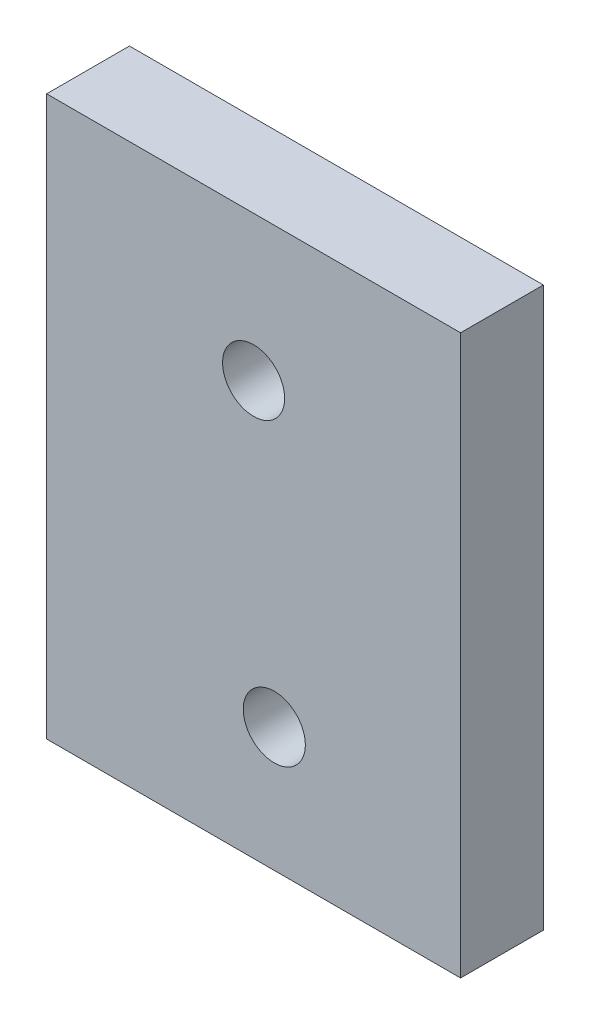
ISO-10303-21;
HEADER;
FILE_DESCRIPTION(('STEP AP214'),'2;1');
FILE_NAME('part.step','',(''),(''),'','','');
FILE_SCHEMA(('AUTOMOTIVE_DESIGN { 1 0 10303 214 1 1 1 1 }'));
ENDSEC;
DATA;
#1=APPLICATION_CONTEXT('core data for automotive mechanical design processes');
#2=APPLICATION_PROTOCOL_DEFINITION('international standard','automotive_design',2000,#1);
#3=PRODUCT_CONTEXT('',#1,'mechanical');
#4=PRODUCT('Part','Part','',(#3));
#5=PRODUCT_RELATED_PRODUCT_CATEGORY('part','',(#4));
#6=PRODUCT_DEFINITION_FORMATION('','',#4);
#7=PRODUCT_DEFINITION_CONTEXT('part definition',#1,'design');
#8=PRODUCT_DEFINITION('design','',#6,#7);
#9=PRODUCT_DEFINITION_SHAPE('','',#8);
#10=(LENGTH_UNIT() NAMED_UNIT(*) SI_UNIT(.MILLI.,.METRE.));
#11=(NAMED_UNIT(*) PLANE_ANGLE_UNIT() SI_UNIT($,.RADIAN.));
#12=(NAMED_UNIT(*) SI_UNIT($,.STERADIAN.) SOLID_ANGLE_UNIT());
#13=UNCERTAINTY_MEASURE_WITH_UNIT(LENGTH_MEASURE(1.E-05),#10,'distance_accuracy_value','');
#14=(GEOMETRIC_REPRESENTATION_CONTEXT(3) GLOBAL_UNCERTAINTY_ASSIGNED_CONTEXT((#13)) GLOBAL_UNIT_ASSIGNED_CONTEXT((#10,
#11,#12)) REPRESENTATION_CONTEXT('',''));
#15=CARTESIAN_POINT('',(0.,0.,0.));
#16=DIRECTION('',(0.,0.,1.));
#17=DIRECTION('',(1.,0.,0.));
#18=AXIS2_PLACEMENT_3D('',#15,#16,#17);
#19=CARTESIAN_POINT('',(0.,0.,4.));
#20=DIRECTION('',(0.,0.,-1.));
#21=DIRECTION('',(-1.,0.,0.));
#22=AXIS2_PLACEMENT_3D('',#19,#20,#21);
#23=PLANE('',#22);
#24=DIRECTION('',(0.,1.,0.));
#25=VECTOR('',#24,1.);
#26=CARTESIAN_POINT('',(10.,-13.5,4.));
#27=LINE('',#26,#25);
#28=CARTESIAN_POINT('',(10.,-13.5,4.));
#29=VERTEX_POINT('',#28);
#30=CARTESIAN_POINT('',(10.,13.5,4.));
#31=VERTEX_POINT('',#30);
#32=EDGE_CURVE('E92',#29,#31,#27,.T.);
#33=ORIENTED_EDGE('',*,*,#32,.T.);
#34=DIRECTION('',(-1.,0.,0.));
#35=VECTOR('',#34,1.);
#36=CARTESIAN_POINT('',(-10.,13.5,4.));
#37=LINE('',#36,#35);
#38=CARTESIAN_POINT('',(-10.,13.5,4.));
#39=VERTEX_POINT('',#38);
#40=EDGE_CURVE('E87',#31,#39,#37,.T.);
#41=ORIENTED_EDGE('',*,*,#40,.T.);
#42=DIRECTION('',(0.,-1.,0.));
#43=VECTOR('',#42,1.);
#44=CARTESIAN_POINT('',(-10.,-13.5,4.));
#45=LINE('',#44,#43);
#46=CARTESIAN_POINT('',(-10.,-13.5,4.));
#47=VERTEX_POINT('',#46);
#48=EDGE_CURVE('E90',#39,#47,#45,.T.);
#49=ORIENTED_EDGE('',*,*,#48,.T.);
#50=DIRECTION('',(1.,0.,0.));
#51=VECTOR('',#50,1.);
#52=CARTESIAN_POINT('',(-10.,-13.5,4.));
#53=LINE('',#52,#51);
#54=EDGE_CURVE('E57',#47,#29,#53,.T.);
#55=ORIENTED_EDGE('',*,*,#54,.T.);
#56=EDGE_LOOP('',(#33,#41,#49,#55));
#57=FACE_BOUND('',#56,.T.);
#58=CARTESIAN_POINT('',(1.00000000000001,-7.49999999999999,4.));
#59=DIRECTION('',(0.,0.,1.));
#60=DIRECTION('',(1.,0.,0.));
#61=AXIS2_PLACEMENT_3D('',#58,#59,#60);
#62=CIRCLE('',#61,1.5);
#63=CARTESIAN_POINT('',(2.50000000000001,-7.49999999999999,4.));
#64=VERTEX_POINT('',#63);
#65=EDGE_CURVE('E112',#64,#64,#62,.T.);
#66=ORIENTED_EDGE('',*,*,#65,.F.);
#67=EDGE_LOOP('',(#66));
#68=FACE_BOUND('',#67,.T.);
#69=CARTESIAN_POINT('',(0.,6.50000000000001,4.));
#70=DIRECTION('',(0.,0.,1.));
#71=DIRECTION('',(1.,0.,0.));
#72=AXIS2_PLACEMENT_3D('',#69,#70,#71);
#73=CIRCLE('',#72,1.5);
#74=CARTESIAN_POINT('',(1.5,6.50000000000001,4.));
#75=VERTEX_POINT('',#74);
#76=EDGE_CURVE('E134',#75,#75,#73,.T.);
#77=ORIENTED_EDGE('',*,*,#76,.F.);
#78=EDGE_LOOP('',(#77));
#79=FACE_BOUND('',#78,.T.);
#80=ADVANCED_FACE('F39',(#57,#68,#79),#23,.F.);
#81=CARTESIAN_POINT('',(0.,0.,0.));
#82=DIRECTION('',(0.,0.,-1.));
#83=DIRECTION('',(-1.,0.,0.));
#84=AXIS2_PLACEMENT_3D('',#81,#82,#83);
#85=PLANE('',#84);
#86=CARTESIAN_POINT('',(1.00000000000001,-7.49999999999999,0.));
#87=DIRECTION('',(0.,0.,1.));
#88=DIRECTION('',(1.,0.,0.));
#89=AXIS2_PLACEMENT_3D('',#86,#87,#88);
#90=CIRCLE('',#89,1.5);
#91=CARTESIAN_POINT('',(2.50000000000001,-7.49999999999999,0.));
#92=VERTEX_POINT('',#91);
#93=EDGE_CURVE('E130',#92,#92,#90,.T.);
#94=ORIENTED_EDGE('',*,*,#93,.T.);
#95=EDGE_LOOP('',(#94));
#96=FACE_BOUND('',#95,.T.);
#97=DIRECTION('',(0.,1.,0.));
#98=VECTOR('',#97,1.);
#99=CARTESIAN_POINT('',(10.,-13.5,0.));
#100=LINE('',#99,#98);
#101=CARTESIAN_POINT('',(10.,-13.5,0.));
#102=VERTEX_POINT('',#101);
#103=CARTESIAN_POINT('',(10.,13.5,0.));
#104=VERTEX_POINT('',#103);
#105=EDGE_CURVE('E108',#102,#104,#100,.T.);
#106=ORIENTED_EDGE('',*,*,#105,.F.);
#107=DIRECTION('',(1.,0.,0.));
#108=VECTOR('',#107,1.);
#109=CARTESIAN_POINT('',(-10.,-13.5,0.));
#110=LINE('',#109,#108);
#111=CARTESIAN_POINT('',(-10.,-13.5,0.));
#112=VERTEX_POINT('',#111);
#113=EDGE_CURVE('E80',#112,#102,#110,.T.);
#114=ORIENTED_EDGE('',*,*,#113,.F.);
#115=DIRECTION('',(0.,-1.,0.));
#116=VECTOR('',#115,1.);
#117=CARTESIAN_POINT('',(-10.,-13.5,0.));
#118=LINE('',#117,#116);
#119=CARTESIAN_POINT('',(-10.,13.5,0.));
#120=VERTEX_POINT('',#119);
#121=EDGE_CURVE('E74',#120,#112,#118,.T.);
#122=ORIENTED_EDGE('',*,*,#121,.F.);
#123=DIRECTION('',(-1.,0.,0.));
#124=VECTOR('',#123,1.);
#125=CARTESIAN_POINT('',(-10.,13.5,0.));
#126=LINE('',#125,#124);
#127=EDGE_CURVE('E97',#104,#120,#126,.T.);
#128=ORIENTED_EDGE('',*,*,#127,.F.);
#129=EDGE_LOOP('',(#106,#114,#122,#128));
#130=FACE_BOUND('',#129,.T.);
#131=CARTESIAN_POINT('',(0.,6.50000000000001,0.));
#132=DIRECTION('',(0.,0.,1.));
#133=DIRECTION('',(1.,0.,0.));
#134=AXIS2_PLACEMENT_3D('',#131,#132,#133);
#135=CIRCLE('',#134,1.5);
#136=CARTESIAN_POINT('',(1.5,6.50000000000001,0.));
#137=VERTEX_POINT('',#136);
#138=EDGE_CURVE('E138',#137,#137,#135,.T.);
#139=ORIENTED_EDGE('',*,*,#138,.T.);
#140=EDGE_LOOP('',(#139));
#141=FACE_BOUND('',#140,.T.);
#142=ADVANCED_FACE('F125',(#96,#130,#141),#85,.T.);
#143=CARTESIAN_POINT('',(10.,-13.5,4.));
#144=DIRECTION('',(-1.,0.,0.));
#145=DIRECTION('',(0.,-1.,0.));
#146=AXIS2_PLACEMENT_3D('',#143,#144,#145);
#147=PLANE('',#146);
#148=ORIENTED_EDGE('',*,*,#105,.T.);
#149=DIRECTION('',(0.,0.,-1.));
#150=VECTOR('',#149,1.);
#151=CARTESIAN_POINT('',(10.,13.5,4.));
#152=LINE('',#151,#150);
#153=EDGE_CURVE('E11',#31,#104,#152,.T.);
#154=ORIENTED_EDGE('',*,*,#153,.F.);
#155=ORIENTED_EDGE('',*,*,#32,.F.);
#156=DIRECTION('',(0.,0.,-1.));
#157=VECTOR('',#156,1.);
#158=CARTESIAN_POINT('',(10.,-13.5,4.));
#159=LINE('',#158,#157);
#160=EDGE_CURVE('E104',#29,#102,#159,.T.);
#161=ORIENTED_EDGE('',*,*,#160,.T.);
#162=EDGE_LOOP('',(#148,#154,#155,#161));
#163=FACE_BOUND('',#162,.T.);
#164=ADVANCED_FACE('F41',(#163),#147,.F.);
#165=CARTESIAN_POINT('',(-10.,13.5,4.));
#166=DIRECTION('',(0.,-1.,0.));
#167=DIRECTION('',(0.,0.,-1.));
#168=AXIS2_PLACEMENT_3D('',#165,#166,#167);
#169=PLANE('',#168);
#170=ORIENTED_EDGE('',*,*,#127,.T.);
#171=DIRECTION('',(0.,0.,-1.));
#172=VECTOR('',#171,1.);
#173=CARTESIAN_POINT('',(-10.,13.5,4.));
#174=LINE('',#173,#172);
#175=EDGE_CURVE('E49',#39,#120,#174,.T.);
#176=ORIENTED_EDGE('',*,*,#175,.F.);
#177=ORIENTED_EDGE('',*,*,#40,.F.);
#178=ORIENTED_EDGE('',*,*,#153,.T.);
#179=EDGE_LOOP('',(#170,#176,#177,#178));
#180=FACE_BOUND('',#179,.T.);
#181=ADVANCED_FACE('F96',(#180),#169,.F.);
#182=CARTESIAN_POINT('',(-10.,-13.5,4.));
#183=DIRECTION('',(1.,0.,0.));
#184=DIRECTION('',(0.,1.,0.));
#185=AXIS2_PLACEMENT_3D('',#182,#183,#184);
#186=PLANE('',#185);
#187=ORIENTED_EDGE('',*,*,#121,.T.);
#188=DIRECTION('',(0.,0.,-1.));
#189=VECTOR('',#188,1.);
#190=CARTESIAN_POINT('',(-10.,-13.5,4.));
#191=LINE('',#190,#189);
#192=EDGE_CURVE('E99',#47,#112,#191,.T.);
#193=ORIENTED_EDGE('',*,*,#192,.F.);
#194=ORIENTED_EDGE('',*,*,#48,.F.);
#195=ORIENTED_EDGE('',*,*,#175,.T.);
#196=EDGE_LOOP('',(#187,#193,#194,#195));
#197=FACE_BOUND('',#196,.T.);
#198=ADVANCED_FACE('F100',(#197),#186,.F.);
#199=CARTESIAN_POINT('',(-10.,-13.5,4.));
#200=DIRECTION('',(0.,1.,0.));
#201=DIRECTION('',(-1.,0.,0.));
#202=AXIS2_PLACEMENT_3D('',#199,#200,#201);
#203=PLANE('',#202);
#204=ORIENTED_EDGE('',*,*,#113,.T.);
#205=ORIENTED_EDGE('',*,*,#160,.F.);
#206=ORIENTED_EDGE('',*,*,#54,.F.);
#207=ORIENTED_EDGE('',*,*,#192,.T.);
#208=EDGE_LOOP('',(#204,#205,#206,#207));
#209=FACE_BOUND('',#208,.T.);
#210=ADVANCED_FACE('F122',(#209),#203,.F.);
#211=CARTESIAN_POINT('',(1.00000000000001,-7.49999999999999,4.));
#212=DIRECTION('',(0.,0.,-1.));
#213=DIRECTION('',(-1.,0.,0.));
#214=AXIS2_PLACEMENT_3D('',#211,#212,#213);
#215=CYLINDRICAL_SURFACE('',#214,1.5);
#216=ORIENTED_EDGE('',*,*,#65,.T.);
#217=EDGE_LOOP('',(#216));
#218=FACE_BOUND('',#217,.T.);
#219=ORIENTED_EDGE('',*,*,#93,.F.);
#220=EDGE_LOOP('',(#219));
#221=FACE_BOUND('',#220,.T.);
#222=ADVANCED_FACE('F157',(#218,#221),#215,.F.);
#223=CARTESIAN_POINT('',(0.,6.50000000000001,4.));
#224=DIRECTION('',(0.,0.,-1.));
#225=DIRECTION('',(-1.,0.,0.));
#226=AXIS2_PLACEMENT_3D('',#223,#224,#225);
#227=CYLINDRICAL_SURFACE('',#226,1.5);
#228=ORIENTED_EDGE('',*,*,#76,.T.);
#229=EDGE_LOOP('',(#228));
#230=FACE_BOUND('',#229,.T.);
#231=ORIENTED_EDGE('',*,*,#138,.F.);
#232=EDGE_LOOP('',(#231));
#233=FACE_BOUND('',#232,.T.);
#234=ADVANCED_FACE('F146',(#230,#233),#227,.F.);
#235=CLOSED_SHELL('',(#80,#142,#164,#181,#198,#210,#222,#234));
#236=MANIFOLD_SOLID_BREP('B2',#235);
#237=ADVANCED_BREP_SHAPE_REPRESENTATION('',(#18,#236),#14);
#238=SHAPE_DEFINITION_REPRESENTATION(#9,#237);
ENDSEC;
END-ISO-10303-21;
